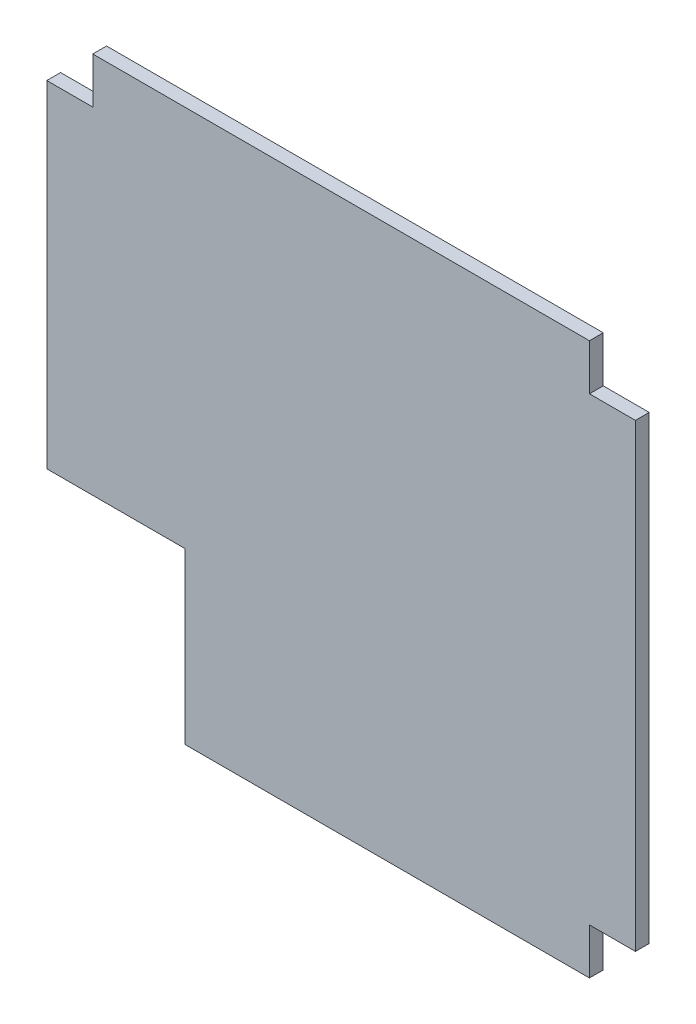
ISO-10303-21;
HEADER;
FILE_DESCRIPTION(('STEP AP214'),'2;1');
FILE_NAME('part.step','',(''),(''),'','','');
FILE_SCHEMA(('AUTOMOTIVE_DESIGN { 1 0 10303 214 1 1 1 1 }'));
ENDSEC;
DATA;
#1=APPLICATION_CONTEXT('core data for automotive mechanical design processes');
#2=APPLICATION_PROTOCOL_DEFINITION('international standard','automotive_design',2000,#1);
#3=PRODUCT_CONTEXT('',#1,'mechanical');
#4=PRODUCT('Part','Part','',(#3));
#5=PRODUCT_RELATED_PRODUCT_CATEGORY('part','',(#4));
#6=PRODUCT_DEFINITION_FORMATION('','',#4);
#7=PRODUCT_DEFINITION_CONTEXT('part definition',#1,'design');
#8=PRODUCT_DEFINITION('design','',#6,#7);
#9=PRODUCT_DEFINITION_SHAPE('','',#8);
#10=(LENGTH_UNIT() NAMED_UNIT(*) SI_UNIT(.MILLI.,.METRE.));
#11=(NAMED_UNIT(*) PLANE_ANGLE_UNIT() SI_UNIT($,.RADIAN.));
#12=(NAMED_UNIT(*) SI_UNIT($,.STERADIAN.) SOLID_ANGLE_UNIT());
#13=UNCERTAINTY_MEASURE_WITH_UNIT(LENGTH_MEASURE(1.E-05),#10,'distance_accuracy_value','');
#14=(GEOMETRIC_REPRESENTATION_CONTEXT(3) GLOBAL_UNCERTAINTY_ASSIGNED_CONTEXT((#13)) GLOBAL_UNIT_ASSIGNED_CONTEXT((#10,
#11,#12)) REPRESENTATION_CONTEXT('',''));
#15=CARTESIAN_POINT('',(0.,0.,0.));
#16=DIRECTION('',(0.,0.,1.));
#17=DIRECTION('',(1.,0.,0.));
#18=AXIS2_PLACEMENT_3D('',#15,#16,#17);
#19=CARTESIAN_POINT('',(294.044304492272,140.,10.));
#20=DIRECTION('',(0.,-1.,0.));
#21=DIRECTION('',(1.,0.,0.));
#22=AXIS2_PLACEMENT_3D('',#19,#20,#21);
#23=PLANE('',#22);
#24=DIRECTION('',(-1.,0.,0.));
#25=VECTOR('',#24,1.);
#26=CARTESIAN_POINT('',(294.044304492272,140.,10.));
#27=LINE('',#26,#25);
#28=CARTESIAN_POINT('',(260.724304492272,140.,10.));
#29=VERTEX_POINT('',#28);
#30=CARTESIAN_POINT('',(-99.2756955077278,140.,10.));
#31=VERTEX_POINT('',#30);
#32=EDGE_CURVE('E159',#29,#31,#27,.T.);
#33=ORIENTED_EDGE('',*,*,#32,.F.);
#34=DIRECTION('',(0.,0.,1.));
#35=VECTOR('',#34,1.);
#36=CARTESIAN_POINT('',(260.724304492272,140.,0.));
#37=LINE('',#36,#35);
#38=CARTESIAN_POINT('',(260.724304492272,140.,0.));
#39=VERTEX_POINT('',#38);
#40=EDGE_CURVE('E210',#39,#29,#37,.T.);
#41=ORIENTED_EDGE('',*,*,#40,.F.);
#42=DIRECTION('',(-1.,0.,0.));
#43=VECTOR('',#42,1.);
#44=CARTESIAN_POINT('',(294.044304492272,140.,0.));
#45=LINE('',#44,#43);
#46=CARTESIAN_POINT('',(-99.2756955077278,140.,0.));
#47=VERTEX_POINT('',#46);
#48=EDGE_CURVE('E161',#39,#47,#45,.T.);
#49=ORIENTED_EDGE('',*,*,#48,.T.);
#50=DIRECTION('',(0.,0.,1.));
#51=VECTOR('',#50,1.);
#52=CARTESIAN_POINT('',(-99.2756955077278,140.,0.));
#53=LINE('',#52,#51);
#54=EDGE_CURVE('E215',#47,#31,#53,.T.);
#55=ORIENTED_EDGE('',*,*,#54,.T.);
#56=EDGE_LOOP('',(#33,#41,#49,#55));
#57=FACE_BOUND('',#56,.T.);
#58=ADVANCED_FACE('F42',(#57),#23,.F.);
#59=CARTESIAN_POINT('',(-132.595695507728,140.,10.));
#60=DIRECTION('',(1.,0.,0.));
#61=DIRECTION('',(0.,0.,-1.));
#62=AXIS2_PLACEMENT_3D('',#59,#60,#61);
#63=PLANE('',#62);
#64=DIRECTION('',(0.,-1.,0.));
#65=VECTOR('',#64,1.);
#66=CARTESIAN_POINT('',(-132.595695507728,140.,0.));
#67=LINE('',#66,#65);
#68=CARTESIAN_POINT('',(-132.595695507728,106.68,0.));
#69=VERTEX_POINT('',#68);
#70=CARTESIAN_POINT('',(-132.595695507728,-137.05,0.));
#71=VERTEX_POINT('',#70);
#72=EDGE_CURVE('E155',#69,#71,#67,.T.);
#73=ORIENTED_EDGE('',*,*,#72,.T.);
#74=DIRECTION('',(0.,0.,1.));
#75=VECTOR('',#74,1.);
#76=CARTESIAN_POINT('',(-132.595695507728,-137.05,0.));
#77=LINE('',#76,#75);
#78=CARTESIAN_POINT('',(-132.595695507728,-137.05,10.));
#79=VERTEX_POINT('',#78);
#80=EDGE_CURVE('E196',#71,#79,#77,.T.);
#81=ORIENTED_EDGE('',*,*,#80,.T.);
#82=DIRECTION('',(0.,-1.,0.));
#83=VECTOR('',#82,1.);
#84=CARTESIAN_POINT('',(-132.595695507728,140.,10.));
#85=LINE('',#84,#83);
#86=CARTESIAN_POINT('',(-132.595695507728,106.68,10.));
#87=VERTEX_POINT('',#86);
#88=EDGE_CURVE('E170',#87,#79,#85,.T.);
#89=ORIENTED_EDGE('',*,*,#88,.F.);
#90=DIRECTION('',(0.,0.,1.));
#91=VECTOR('',#90,1.);
#92=CARTESIAN_POINT('',(-132.595695507728,106.68,0.));
#93=LINE('',#92,#91);
#94=EDGE_CURVE('E235',#69,#87,#93,.T.);
#95=ORIENTED_EDGE('',*,*,#94,.F.);
#96=EDGE_LOOP('',(#73,#81,#89,#95));
#97=FACE_BOUND('',#96,.T.);
#98=ADVANCED_FACE('F263',(#97),#63,.F.);
#99=CARTESIAN_POINT('',(-132.595695507728,-260.,10.));
#100=DIRECTION('',(0.,1.,0.));
#101=DIRECTION('',(0.,0.,1.));
#102=AXIS2_PLACEMENT_3D('',#99,#100,#101);
#103=PLANE('',#102);
#104=DIRECTION('',(1.,0.,0.));
#105=VECTOR('',#104,1.);
#106=CARTESIAN_POINT('',(-132.595695507728,-260.,10.));
#107=LINE('',#106,#105);
#108=CARTESIAN_POINT('',(-32.5956955077278,-260.,10.));
#109=VERTEX_POINT('',#108);
#110=CARTESIAN_POINT('',(260.724304492272,-260.,10.));
#111=VERTEX_POINT('',#110);
#112=EDGE_CURVE('E51',#109,#111,#107,.T.);
#113=ORIENTED_EDGE('',*,*,#112,.F.);
#114=DIRECTION('',(0.,0.,1.));
#115=VECTOR('',#114,1.);
#116=CARTESIAN_POINT('',(-32.5956955077278,-260.,0.));
#117=LINE('',#116,#115);
#118=CARTESIAN_POINT('',(-32.5956955077278,-260.,0.));
#119=VERTEX_POINT('',#118);
#120=EDGE_CURVE('E137',#119,#109,#117,.T.);
#121=ORIENTED_EDGE('',*,*,#120,.F.);
#122=DIRECTION('',(1.,0.,0.));
#123=VECTOR('',#122,1.);
#124=CARTESIAN_POINT('',(-132.595695507728,-260.,0.));
#125=LINE('',#124,#123);
#126=CARTESIAN_POINT('',(260.724304492272,-260.,0.));
#127=VERTEX_POINT('',#126);
#128=EDGE_CURVE('E149',#119,#127,#125,.T.);
#129=ORIENTED_EDGE('',*,*,#128,.T.);
#130=DIRECTION('',(0.,0.,1.));
#131=VECTOR('',#130,1.);
#132=CARTESIAN_POINT('',(260.724304492272,-260.,0.));
#133=LINE('',#132,#131);
#134=EDGE_CURVE('E192',#127,#111,#133,.T.);
#135=ORIENTED_EDGE('',*,*,#134,.T.);
#136=EDGE_LOOP('',(#113,#121,#129,#135));
#137=FACE_BOUND('',#136,.T.);
#138=ADVANCED_FACE('F147',(#137),#103,.F.);
#139=CARTESIAN_POINT('',(294.044304492272,-260.,10.));
#140=DIRECTION('',(-1.,0.,0.));
#141=DIRECTION('',(0.,0.,1.));
#142=AXIS2_PLACEMENT_3D('',#139,#140,#141);
#143=PLANE('',#142);
#144=DIRECTION('',(0.,1.,0.));
#145=VECTOR('',#144,1.);
#146=CARTESIAN_POINT('',(294.044304492272,-260.,10.));
#147=LINE('',#146,#145);
#148=CARTESIAN_POINT('',(294.044304492272,-226.68,10.));
#149=VERTEX_POINT('',#148);
#150=CARTESIAN_POINT('',(294.044304492272,106.68,10.));
#151=VERTEX_POINT('',#150);
#152=EDGE_CURVE('E11',#149,#151,#147,.T.);
#153=ORIENTED_EDGE('',*,*,#152,.F.);
#154=DIRECTION('',(0.,0.,1.));
#155=VECTOR('',#154,1.);
#156=CARTESIAN_POINT('',(294.044304492272,-226.68,0.));
#157=LINE('',#156,#155);
#158=CARTESIAN_POINT('',(294.044304492272,-226.68,0.));
#159=VERTEX_POINT('',#158);
#160=EDGE_CURVE('E183',#159,#149,#157,.T.);
#161=ORIENTED_EDGE('',*,*,#160,.F.);
#162=DIRECTION('',(0.,1.,0.));
#163=VECTOR('',#162,1.);
#164=CARTESIAN_POINT('',(294.044304492272,-260.,0.));
#165=LINE('',#164,#163);
#166=CARTESIAN_POINT('',(294.044304492272,106.68,0.));
#167=VERTEX_POINT('',#166);
#168=EDGE_CURVE('E45',#159,#167,#165,.T.);
#169=ORIENTED_EDGE('',*,*,#168,.T.);
#170=DIRECTION('',(0.,0.,1.));
#171=VECTOR('',#170,1.);
#172=CARTESIAN_POINT('',(294.044304492272,106.68,0.));
#173=LINE('',#172,#171);
#174=EDGE_CURVE('E188',#167,#151,#173,.T.);
#175=ORIENTED_EDGE('',*,*,#174,.T.);
#176=EDGE_LOOP('',(#153,#161,#169,#175));
#177=FACE_BOUND('',#176,.T.);
#178=ADVANCED_FACE('F289',(#177),#143,.F.);
#179=CARTESIAN_POINT('',(0.,0.,10.));
#180=DIRECTION('',(0.,0.,1.));
#181=DIRECTION('',(1.,0.,0.));
#182=AXIS2_PLACEMENT_3D('',#179,#180,#181);
#183=PLANE('',#182);
#184=DIRECTION('',(-1.,0.,0.));
#185=VECTOR('',#184,1.);
#186=CARTESIAN_POINT('',(-132.595695507728,-137.05,10.));
#187=LINE('',#186,#185);
#188=CARTESIAN_POINT('',(-32.5956955077278,-137.05,10.));
#189=VERTEX_POINT('',#188);
#190=EDGE_CURVE('E143',#189,#79,#187,.T.);
#191=ORIENTED_EDGE('',*,*,#190,.F.);
#192=DIRECTION('',(0.,1.,0.));
#193=VECTOR('',#192,1.);
#194=CARTESIAN_POINT('',(-32.5956955077278,-137.05,10.));
#195=LINE('',#194,#193);
#196=EDGE_CURVE('E256',#109,#189,#195,.T.);
#197=ORIENTED_EDGE('',*,*,#196,.F.);
#198=ORIENTED_EDGE('',*,*,#112,.T.);
#199=DIRECTION('',(0.,-1.,0.));
#200=VECTOR('',#199,1.);
#201=CARTESIAN_POINT('',(260.724304492272,-260.,10.));
#202=LINE('',#201,#200);
#203=CARTESIAN_POINT('',(260.724304492272,-226.68,10.));
#204=VERTEX_POINT('',#203);
#205=EDGE_CURVE('E180',#204,#111,#202,.T.);
#206=ORIENTED_EDGE('',*,*,#205,.F.);
#207=DIRECTION('',(-1.,0.,0.));
#208=VECTOR('',#207,1.);
#209=CARTESIAN_POINT('',(294.044304492272,-226.68,10.));
#210=LINE('',#209,#208);
#211=EDGE_CURVE('E184',#149,#204,#210,.T.);
#212=ORIENTED_EDGE('',*,*,#211,.F.);
#213=ORIENTED_EDGE('',*,*,#152,.T.);
#214=DIRECTION('',(1.,0.,0.));
#215=VECTOR('',#214,1.);
#216=CARTESIAN_POINT('',(294.044304492272,106.68,10.));
#217=LINE('',#216,#215);
#218=CARTESIAN_POINT('',(260.724304492272,106.68,10.));
#219=VERTEX_POINT('',#218);
#220=EDGE_CURVE('E205',#219,#151,#217,.T.);
#221=ORIENTED_EDGE('',*,*,#220,.F.);
#222=DIRECTION('',(0.,-1.,0.));
#223=VECTOR('',#222,1.);
#224=CARTESIAN_POINT('',(260.724304492272,140.,10.));
#225=LINE('',#224,#223);
#226=EDGE_CURVE('E211',#29,#219,#225,.T.);
#227=ORIENTED_EDGE('',*,*,#226,.F.);
#228=ORIENTED_EDGE('',*,*,#32,.T.);
#229=DIRECTION('',(0.,1.,0.));
#230=VECTOR('',#229,1.);
#231=CARTESIAN_POINT('',(-99.2756955077278,140.,10.));
#232=LINE('',#231,#230);
#233=CARTESIAN_POINT('',(-99.2756955077278,106.68,10.));
#234=VERTEX_POINT('',#233);
#235=EDGE_CURVE('E230',#234,#31,#232,.T.);
#236=ORIENTED_EDGE('',*,*,#235,.F.);
#237=DIRECTION('',(1.,0.,0.));
#238=VECTOR('',#237,1.);
#239=CARTESIAN_POINT('',(-132.595695507728,106.68,10.));
#240=LINE('',#239,#238);
#241=EDGE_CURVE('E166',#87,#234,#240,.T.);
#242=ORIENTED_EDGE('',*,*,#241,.F.);
#243=ORIENTED_EDGE('',*,*,#88,.T.);
#244=EDGE_LOOP('',(#191,#197,#198,#206,#212,#213,#221,#227,#228,#236,#242,#243));
#245=FACE_BOUND('',#244,.T.);
#246=ADVANCED_FACE('F272',(#245),#183,.T.);
#247=CARTESIAN_POINT('',(0.,0.,0.));
#248=DIRECTION('',(0.,0.,1.));
#249=DIRECTION('',(1.,0.,0.));
#250=AXIS2_PLACEMENT_3D('',#247,#248,#249);
#251=PLANE('',#250);
#252=DIRECTION('',(0.,1.,0.));
#253=VECTOR('',#252,1.);
#254=CARTESIAN_POINT('',(-32.5956955077278,-137.05,0.));
#255=LINE('',#254,#253);
#256=CARTESIAN_POINT('',(-32.5956955077278,-137.05,0.));
#257=VERTEX_POINT('',#256);
#258=EDGE_CURVE('E133',#119,#257,#255,.T.);
#259=ORIENTED_EDGE('',*,*,#258,.T.);
#260=DIRECTION('',(-1.,0.,0.));
#261=VECTOR('',#260,1.);
#262=CARTESIAN_POINT('',(-132.595695507728,-137.05,0.));
#263=LINE('',#262,#261);
#264=EDGE_CURVE('E59',#257,#71,#263,.T.);
#265=ORIENTED_EDGE('',*,*,#264,.T.);
#266=ORIENTED_EDGE('',*,*,#72,.F.);
#267=DIRECTION('',(1.,0.,0.));
#268=VECTOR('',#267,1.);
#269=CARTESIAN_POINT('',(-132.595695507728,106.68,0.));
#270=LINE('',#269,#268);
#271=CARTESIAN_POINT('',(-99.2756955077278,106.68,0.));
#272=VERTEX_POINT('',#271);
#273=EDGE_CURVE('E226',#69,#272,#270,.T.);
#274=ORIENTED_EDGE('',*,*,#273,.T.);
#275=DIRECTION('',(0.,1.,0.));
#276=VECTOR('',#275,1.);
#277=CARTESIAN_POINT('',(-99.2756955077278,140.,0.));
#278=LINE('',#277,#276);
#279=EDGE_CURVE('E231',#272,#47,#278,.T.);
#280=ORIENTED_EDGE('',*,*,#279,.T.);
#281=ORIENTED_EDGE('',*,*,#48,.F.);
#282=DIRECTION('',(0.,-1.,0.));
#283=VECTOR('',#282,1.);
#284=CARTESIAN_POINT('',(260.724304492272,140.,0.));
#285=LINE('',#284,#283);
#286=CARTESIAN_POINT('',(260.724304492272,106.68,0.));
#287=VERTEX_POINT('',#286);
#288=EDGE_CURVE('E201',#39,#287,#285,.T.);
#289=ORIENTED_EDGE('',*,*,#288,.T.);
#290=DIRECTION('',(1.,0.,0.));
#291=VECTOR('',#290,1.);
#292=CARTESIAN_POINT('',(294.044304492272,106.68,0.));
#293=LINE('',#292,#291);
#294=EDGE_CURVE('E206',#287,#167,#293,.T.);
#295=ORIENTED_EDGE('',*,*,#294,.T.);
#296=ORIENTED_EDGE('',*,*,#168,.F.);
#297=DIRECTION('',(-1.,0.,0.));
#298=VECTOR('',#297,1.);
#299=CARTESIAN_POINT('',(294.044304492272,-226.68,0.));
#300=LINE('',#299,#298);
#301=CARTESIAN_POINT('',(260.724304492272,-226.68,0.));
#302=VERTEX_POINT('',#301);
#303=EDGE_CURVE('E177',#159,#302,#300,.T.);
#304=ORIENTED_EDGE('',*,*,#303,.T.);
#305=DIRECTION('',(0.,-1.,0.));
#306=VECTOR('',#305,1.);
#307=CARTESIAN_POINT('',(260.724304492272,-260.,0.));
#308=LINE('',#307,#306);
#309=EDGE_CURVE('E67',#302,#127,#308,.T.);
#310=ORIENTED_EDGE('',*,*,#309,.T.);
#311=ORIENTED_EDGE('',*,*,#128,.F.);
#312=EDGE_LOOP('',(#259,#265,#266,#274,#280,#281,#289,#295,#296,#304,#310,#311));
#313=FACE_BOUND('',#312,.T.);
#314=ADVANCED_FACE('F152',(#313),#251,.F.);
#315=CARTESIAN_POINT('',(-99.2756955077278,140.,0.));
#316=DIRECTION('',(1.,0.,0.));
#317=DIRECTION('',(0.,0.,-1.));
#318=AXIS2_PLACEMENT_3D('',#315,#316,#317);
#319=PLANE('',#318);
#320=ORIENTED_EDGE('',*,*,#235,.T.);
#321=ORIENTED_EDGE('',*,*,#54,.F.);
#322=ORIENTED_EDGE('',*,*,#279,.F.);
#323=DIRECTION('',(0.,0.,1.));
#324=VECTOR('',#323,1.);
#325=CARTESIAN_POINT('',(-99.2756955077278,106.68,0.));
#326=LINE('',#325,#324);
#327=EDGE_CURVE('E244',#272,#234,#326,.T.);
#328=ORIENTED_EDGE('',*,*,#327,.T.);
#329=EDGE_LOOP('',(#320,#321,#322,#328));
#330=FACE_BOUND('',#329,.T.);
#331=ADVANCED_FACE('F276',(#330),#319,.F.);
#332=CARTESIAN_POINT('',(-132.595695507728,106.68,0.));
#333=DIRECTION('',(0.,-1.,0.));
#334=DIRECTION('',(0.,0.,-1.));
#335=AXIS2_PLACEMENT_3D('',#332,#333,#334);
#336=PLANE('',#335);
#337=ORIENTED_EDGE('',*,*,#241,.T.);
#338=ORIENTED_EDGE('',*,*,#327,.F.);
#339=ORIENTED_EDGE('',*,*,#273,.F.);
#340=ORIENTED_EDGE('',*,*,#94,.T.);
#341=EDGE_LOOP('',(#337,#338,#339,#340));
#342=FACE_BOUND('',#341,.T.);
#343=ADVANCED_FACE('F267',(#342),#336,.F.);
#344=CARTESIAN_POINT('',(294.044304492272,106.68,0.));
#345=DIRECTION('',(0.,-1.,0.));
#346=DIRECTION('',(0.,0.,-1.));
#347=AXIS2_PLACEMENT_3D('',#344,#345,#346);
#348=PLANE('',#347);
#349=ORIENTED_EDGE('',*,*,#220,.T.);
#350=ORIENTED_EDGE('',*,*,#174,.F.);
#351=ORIENTED_EDGE('',*,*,#294,.F.);
#352=DIRECTION('',(0.,0.,1.));
#353=VECTOR('',#352,1.);
#354=CARTESIAN_POINT('',(260.724304492272,106.68,0.));
#355=LINE('',#354,#353);
#356=EDGE_CURVE('E221',#287,#219,#355,.T.);
#357=ORIENTED_EDGE('',*,*,#356,.T.);
#358=EDGE_LOOP('',(#349,#350,#351,#357));
#359=FACE_BOUND('',#358,.T.);
#360=ADVANCED_FACE('F286',(#359),#348,.F.);
#361=CARTESIAN_POINT('',(260.724304492272,140.,0.));
#362=DIRECTION('',(-1.,0.,0.));
#363=DIRECTION('',(0.,0.,1.));
#364=AXIS2_PLACEMENT_3D('',#361,#362,#363);
#365=PLANE('',#364);
#366=ORIENTED_EDGE('',*,*,#226,.T.);
#367=ORIENTED_EDGE('',*,*,#356,.F.);
#368=ORIENTED_EDGE('',*,*,#288,.F.);
#369=ORIENTED_EDGE('',*,*,#40,.T.);
#370=EDGE_LOOP('',(#366,#367,#368,#369));
#371=FACE_BOUND('',#370,.T.);
#372=ADVANCED_FACE('F283',(#371),#365,.F.);
#373=CARTESIAN_POINT('',(260.724304492272,-260.,0.));
#374=DIRECTION('',(-1.,0.,0.));
#375=DIRECTION('',(0.,0.,1.));
#376=AXIS2_PLACEMENT_3D('',#373,#374,#375);
#377=PLANE('',#376);
#378=ORIENTED_EDGE('',*,*,#205,.T.);
#379=ORIENTED_EDGE('',*,*,#134,.F.);
#380=ORIENTED_EDGE('',*,*,#309,.F.);
#381=DIRECTION('',(0.,0.,1.));
#382=VECTOR('',#381,1.);
#383=CARTESIAN_POINT('',(260.724304492272,-226.68,0.));
#384=LINE('',#383,#382);
#385=EDGE_CURVE('E195',#302,#204,#384,.T.);
#386=ORIENTED_EDGE('',*,*,#385,.T.);
#387=EDGE_LOOP('',(#378,#379,#380,#386));
#388=FACE_BOUND('',#387,.T.);
#389=ADVANCED_FACE('F295',(#388),#377,.F.);
#390=CARTESIAN_POINT('',(294.044304492272,-226.68,0.));
#391=DIRECTION('',(0.,1.,0.));
#392=DIRECTION('',(0.,0.,1.));
#393=AXIS2_PLACEMENT_3D('',#390,#391,#392);
#394=PLANE('',#393);
#395=ORIENTED_EDGE('',*,*,#211,.T.);
#396=ORIENTED_EDGE('',*,*,#385,.F.);
#397=ORIENTED_EDGE('',*,*,#303,.F.);
#398=ORIENTED_EDGE('',*,*,#160,.T.);
#399=EDGE_LOOP('',(#395,#396,#397,#398));
#400=FACE_BOUND('',#399,.T.);
#401=ADVANCED_FACE('F294',(#400),#394,.F.);
#402=CARTESIAN_POINT('',(-132.595695507728,-137.05,0.));
#403=DIRECTION('',(0.,1.,0.));
#404=DIRECTION('',(0.,0.,1.));
#405=AXIS2_PLACEMENT_3D('',#402,#403,#404);
#406=PLANE('',#405);
#407=ORIENTED_EDGE('',*,*,#190,.T.);
#408=ORIENTED_EDGE('',*,*,#80,.F.);
#409=ORIENTED_EDGE('',*,*,#264,.F.);
#410=DIRECTION('',(0.,0.,1.));
#411=VECTOR('',#410,1.);
#412=CARTESIAN_POINT('',(-32.5956955077278,-137.05,0.));
#413=LINE('',#412,#411);
#414=EDGE_CURVE('E139',#257,#189,#413,.T.);
#415=ORIENTED_EDGE('',*,*,#414,.T.);
#416=EDGE_LOOP('',(#407,#408,#409,#415));
#417=FACE_BOUND('',#416,.T.);
#418=ADVANCED_FACE('F302',(#417),#406,.F.);
#419=CARTESIAN_POINT('',(-32.5956955077278,-137.05,0.));
#420=DIRECTION('',(1.,0.,0.));
#421=DIRECTION('',(0.,0.,-1.));
#422=AXIS2_PLACEMENT_3D('',#419,#420,#421);
#423=PLANE('',#422);
#424=ORIENTED_EDGE('',*,*,#196,.T.);
#425=ORIENTED_EDGE('',*,*,#414,.F.);
#426=ORIENTED_EDGE('',*,*,#258,.F.);
#427=ORIENTED_EDGE('',*,*,#120,.T.);
#428=EDGE_LOOP('',(#424,#425,#426,#427));
#429=FACE_BOUND('',#428,.T.);
#430=ADVANCED_FACE('F136',(#429),#423,.F.);
#431=CLOSED_SHELL('',(#58,#98,#138,#178,#246,#314,#331,#343,#360,#372,#389,#401,#418,#430));
#432=MANIFOLD_SOLID_BREP('B2',#431);
#433=ADVANCED_BREP_SHAPE_REPRESENTATION('',(#18,#432),#14);
#434=SHAPE_DEFINITION_REPRESENTATION(#9,#433);
ENDSEC;
END-ISO-10303-21;
